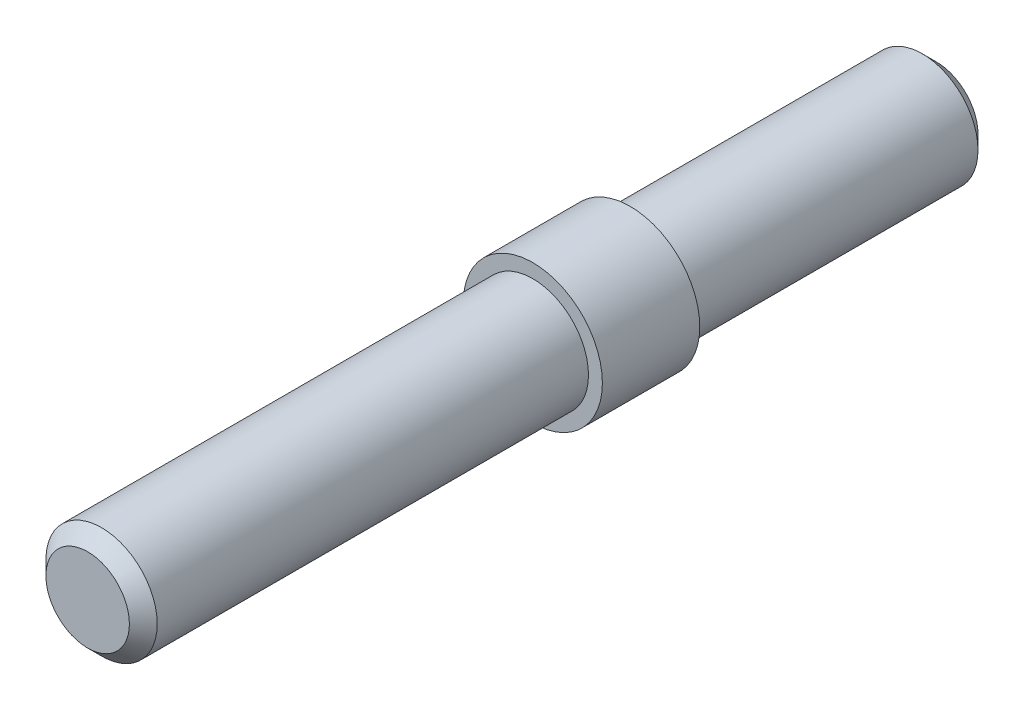
ISO-10303-21;
HEADER;
FILE_DESCRIPTION(('STEP AP214'),'2;1');
FILE_NAME('part.step','',(''),(''),'','','');
FILE_SCHEMA(('AUTOMOTIVE_DESIGN { 1 0 10303 214 1 1 1 1 }'));
ENDSEC;
DATA;
#1=APPLICATION_CONTEXT('core data for automotive mechanical design processes');
#2=APPLICATION_PROTOCOL_DEFINITION('international standard','automotive_design',2000,#1);
#3=PRODUCT_CONTEXT('',#1,'mechanical');
#4=PRODUCT('Part','Part','',(#3));
#5=PRODUCT_RELATED_PRODUCT_CATEGORY('part','',(#4));
#6=PRODUCT_DEFINITION_FORMATION('','',#4);
#7=PRODUCT_DEFINITION_CONTEXT('part definition',#1,'design');
#8=PRODUCT_DEFINITION('design','',#6,#7);
#9=PRODUCT_DEFINITION_SHAPE('','',#8);
#10=(LENGTH_UNIT() NAMED_UNIT(*) SI_UNIT(.MILLI.,.METRE.));
#11=(NAMED_UNIT(*) PLANE_ANGLE_UNIT() SI_UNIT($,.RADIAN.));
#12=(NAMED_UNIT(*) SI_UNIT($,.STERADIAN.) SOLID_ANGLE_UNIT());
#13=UNCERTAINTY_MEASURE_WITH_UNIT(LENGTH_MEASURE(1.E-05),#10,'distance_accuracy_value','');
#14=(GEOMETRIC_REPRESENTATION_CONTEXT(3) GLOBAL_UNCERTAINTY_ASSIGNED_CONTEXT((#13)) GLOBAL_UNIT_ASSIGNED_CONTEXT((#10,
#11,#12)) REPRESENTATION_CONTEXT('',''));
#15=CARTESIAN_POINT('',(0.,0.,0.));
#16=DIRECTION('',(0.,0.,1.));
#17=DIRECTION('',(1.,0.,0.));
#18=AXIS2_PLACEMENT_3D('',#15,#16,#17);
#19=CARTESIAN_POINT('',(0.,0.,-16.));
#20=DIRECTION('',(0.,0.,1.));
#21=DIRECTION('',(1.,0.,0.));
#22=AXIS2_PLACEMENT_3D('',#19,#20,#21);
#23=CYLINDRICAL_SURFACE('',#22,4.);
#24=CARTESIAN_POINT('',(0.,0.,13.));
#25=DIRECTION('',(0.,0.,1.));
#26=DIRECTION('',(1.,0.,0.));
#27=AXIS2_PLACEMENT_3D('',#24,#25,#26);
#28=CIRCLE('',#27,4.);
#29=CARTESIAN_POINT('',(4.,0.,13.));
#30=VERTEX_POINT('',#29);
#31=EDGE_CURVE('E87',#30,#30,#28,.F.);
#32=ORIENTED_EDGE('',*,*,#31,.F.);
#33=EDGE_LOOP('',(#32));
#34=FACE_BOUND('',#33,.T.);
#35=CARTESIAN_POINT('',(0.,0.,44.));
#36=DIRECTION('',(0.,0.,1.));
#37=DIRECTION('',(1.,0.,0.));
#38=AXIS2_PLACEMENT_3D('',#35,#36,#37);
#39=CIRCLE('',#38,4.);
#40=CARTESIAN_POINT('',(4.,0.,44.));
#41=VERTEX_POINT('',#40);
#42=EDGE_CURVE('E93',#41,#41,#39,.F.);
#43=ORIENTED_EDGE('',*,*,#42,.T.);
#44=EDGE_LOOP('',(#43));
#45=FACE_BOUND('',#44,.T.);
#46=CARTESIAN_POINT('',(0.,-4.,19.));
#47=CARTESIAN_POINT('',(-0.081235058937853,-4.00000217456151,19.0000029023031));
#48=CARTESIAN_POINT('',(-0.162450241781792,-3.99750379283184,18.9933802397516));
#49=CARTESIAN_POINT('',(-0.322453452352361,-3.98778696006928,18.9671718047301));
#50=CARTESIAN_POINT('',(-0.401241827987616,-3.98056918893993,18.9475878995294));
#51=CARTESIAN_POINT('',(-0.554060784990879,-3.96218832391545,18.8962469982282));
#52=CARTESIAN_POINT('',(-0.628100224162278,-3.9510328434944,18.8645134831782));
#53=CARTESIAN_POINT('',(-0.769799310160254,-3.92588767765353,18.7898935869842));
#54=CARTESIAN_POINT('',(-0.83745723917788,-3.91189723227548,18.7470042144558));
#55=CARTESIAN_POINT('',(-0.967346417045826,-3.88186246971217,18.6493874689291));
#56=CARTESIAN_POINT('',(-1.02927073015119,-3.86576002583566,18.5942697377406));
#57=CARTESIAN_POINT('',(-1.14324421474363,-3.83360220871327,18.4745895653412));
#58=CARTESIAN_POINT('',(-1.19529036359203,-3.81754685135033,18.4100242439121));
#59=CARTESIAN_POINT('',(-1.28998202215985,-3.78662470617731,18.2702825324768));
#60=CARTESIAN_POINT('',(-1.3321939319576,-3.77182648820818,18.1947956334542));
#61=CARTESIAN_POINT('',(-1.40318646334085,-3.74599860237433,18.0371516458315));
#62=CARTESIAN_POINT('',(-1.43197244961239,-3.73496742975881,17.9549972368449));
#63=CARTESIAN_POINT('',(-1.47408431017549,-3.71854412824136,17.7898832597418));
#64=CARTESIAN_POINT('',(-1.48799593218558,-3.71293924350838,17.7070949615646));
#65=CARTESIAN_POINT('',(-1.50179556531648,-3.70738061461215,17.5401838420062));
#66=CARTESIAN_POINT('',(-1.50168936802631,-3.70742453659305,17.4560615861255));
#67=CARTESIAN_POINT('',(-1.48790429610018,-3.71297511632055,17.294230474787));
#68=CARTESIAN_POINT('',(-1.47503808509004,-3.71815468871122,17.2164390939558));
#69=CARTESIAN_POINT('',(-1.4374416786833,-3.73284938059529,17.0642128495947));
#70=CARTESIAN_POINT('',(-1.41270969663258,-3.74236515298863,16.9897784933861));
#71=CARTESIAN_POINT('',(-1.35163748571904,-3.76485702190253,16.8447229322718));
#72=CARTESIAN_POINT('',(-1.31508648737101,-3.77789517988166,16.7742005138787));
#73=CARTESIAN_POINT('',(-1.23156073762698,-3.80594210139319,16.640054262409));
#74=CARTESIAN_POINT('',(-1.18458238728897,-3.82095154457158,16.5764328224803));
#75=CARTESIAN_POINT('',(-1.07781780766549,-3.85248038859113,16.4533963363491));
#76=CARTESIAN_POINT('',(-1.01738298716955,-3.86903347455671,16.3945513592519));
#77=CARTESIAN_POINT('',(-0.887312590819021,-3.90091728164086,16.2876620337942));
#78=CARTESIAN_POINT('',(-0.817675603497365,-3.91624781465952,16.2396193453943));
#79=CARTESIAN_POINT('',(-0.669723436992422,-3.9442639480908,16.1550696029375));
#80=CARTESIAN_POINT('',(-0.591290713844721,-3.95690498259616,16.1187524187789));
#81=CARTESIAN_POINT('',(-0.428836850524584,-3.97778718326962,16.06001739573));
#82=CARTESIAN_POINT('',(-0.344818210845768,-3.98603030341493,16.0375933834389));
#83=CARTESIAN_POINT('',(-0.178375243148666,-3.99684443228065,16.0083772124581));
#84=CARTESIAN_POINT('',(-0.0961036195622094,-3.99969369025686,16.0008173936175));
#85=CARTESIAN_POINT('',(0.0685724752550243,-4.00025893700126,15.9993089361001));
#86=CARTESIAN_POINT('',(0.150976912983373,-3.99797606386863,16.0053572796832));
#87=CARTESIAN_POINT('',(0.310262048561859,-3.98871709772643,16.0303100423087));
#88=CARTESIAN_POINT('',(0.387233328007336,-3.98192470962305,16.0487115437371));
#89=CARTESIAN_POINT('',(0.536941754957221,-3.96451477091717,16.0971860725473));
#90=CARTESIAN_POINT('',(0.609678350347534,-3.9538967228203,16.127260617948));
#91=CARTESIAN_POINT('',(0.751247765110156,-3.92949624407681,16.1991864124395));
#92=CARTESIAN_POINT('',(0.819903083557797,-3.91563000209348,16.2413577292234));
#93=CARTESIAN_POINT('',(0.949392711726627,-3.88626671564664,16.3359181031716));
#94=CARTESIAN_POINT('',(1.01022412027045,-3.87076907009516,16.3883109325452));
#95=CARTESIAN_POINT('',(1.12603079874454,-3.83873329490989,16.5054041221243));
#96=CARTESIAN_POINT('',(1.18046154123569,-3.82218696503729,16.5706421827727));
#97=CARTESIAN_POINT('',(1.27771050031904,-3.79078815746854,16.7096513847077));
#98=CARTESIAN_POINT('',(1.32052767414519,-3.77593583194399,16.7834232913885));
#99=CARTESIAN_POINT('',(1.39337773518998,-3.74966829822463,16.9380159867723));
#100=CARTESIAN_POINT('',(1.42335685446918,-3.73826760328493,17.0188647459104));
#101=CARTESIAN_POINT('',(1.46907883466889,-3.72054032891005,17.1850097636878));
#102=CARTESIAN_POINT('',(1.48483050305535,-3.71421061057491,17.2703032361981));
#103=CARTESIAN_POINT('',(1.50086347097839,-3.70775894792573,17.4370161595411));
#104=CARTESIAN_POINT('',(1.50207331495838,-3.70726444523341,17.5183326317169));
#105=CARTESIAN_POINT('',(1.49136715641593,-3.71158412745292,17.6799453162762));
#106=CARTESIAN_POINT('',(1.47945239850124,-3.71639780898899,17.7602416246716));
#107=CARTESIAN_POINT('',(1.44355815630242,-3.73048141585432,17.9150472267166));
#108=CARTESIAN_POINT('',(1.41995798316524,-3.73961085376663,17.9896583462453));
#109=CARTESIAN_POINT('',(1.3616969677992,-3.76121548297845,18.1339055084944));
#110=CARTESIAN_POINT('',(1.32703332944945,-3.77369151995215,18.2035402880701));
#111=CARTESIAN_POINT('',(1.24552075938154,-3.80139723903964,18.3398267896976));
#112=CARTESIAN_POINT('',(1.1981283280301,-3.81673698440964,18.4061307967999));
#113=CARTESIAN_POINT('',(1.09334485729906,-3.84806246757177,18.5301415609712));
#114=CARTESIAN_POINT('',(1.03595064012808,-3.86404840943145,18.5878455747868));
#115=CARTESIAN_POINT('',(0.909080396784625,-3.89590424609881,18.6962019558218));
#116=CARTESIAN_POINT('',(0.839118644212994,-3.91172104900645,18.7463037534347));
#117=CARTESIAN_POINT('',(0.691213223200823,-3.9405451445703,18.8340226552766));
#118=CARTESIAN_POINT('',(0.613268934090623,-3.95355221851559,18.8716387877364));
#119=CARTESIAN_POINT('',(0.447999082002313,-3.9757429260668,18.9343768290483));
#120=CARTESIAN_POINT('',(0.360413422234209,-3.98473657158356,18.9588870646019));
#121=CARTESIAN_POINT('',(0.181875733606382,-3.99686242179587,18.9916929599207));
#122=CARTESIAN_POINT('',(0.0909254163648588,-3.99999756603967,18.9999967514873));
#123=CARTESIAN_POINT('',(0.,-4.,19.));
#124=B_SPLINE_CURVE_WITH_KNOTS('',3,(#46,#47,#48,#49,#50,#51,#52,#53,#54,#55,#56,#57,#58,#59,
#60,#61,#62,#63,#64,#65,#66,#67,#68,#69,#70,#71,#72,#73,#74,#75,#76,#77,#78,#79,#80,#81,#82,#83,
#84,#85,#86,#87,#88,#89,#90,#91,#92,#93,#94,#95,#96,#97,#98,#99,#100,#101,#102,#103,#104,#105,
#106,#107,#108,#109,#110,#111,#112,#113,#114,#115,#116,#117,#118,#119,#120,#121,#122,#123),
.UNSPECIFIED.,.T.,.F.,(4,2,2,2,2,2,2,2,2,2,2,2,2,2,2,2,2,2,2,2,2,2,2,2,2,2,2,2,2,2,2,2,2,2,2,2,
2,2,4),(0.,0.24336980156056,0.486704549530461,0.729571369213573,0.97250337960949,
1.22473618582715,1.47704604925622,1.73896674501659,2.00078269352134,2.25185874416902,
2.50283106079707,2.73878345119972,2.97477138060589,3.21522408387019,3.45575990744259,
3.71246153335813,3.96920257905066,4.22991375286075,4.49050899698846,4.73725019635926,
4.98393668390521,5.2211443792384,5.45838293254454,5.702592218596,5.94689180019869,
6.20536519455659,6.46386178920142,6.72343066727205,6.98283874956508,7.22558763480253,
7.4683135021126,7.70363142426534,7.93900886656507,8.18672471884272,8.43451941997063,
8.69572329654039,8.95694749805103,9.22948515032043,9.50188601796128),.UNSPECIFIED.);
#125=CARTESIAN_POINT('',(0.,-4.,19.));
#126=VERTEX_POINT('',#125);
#127=EDGE_CURVE('E142',#126,#126,#124,.T.);
#128=ORIENTED_EDGE('',*,*,#127,.F.);
#129=EDGE_LOOP('',(#128));
#130=FACE_BOUND('',#129,.T.);
#131=ADVANCED_FACE('F72',(#34,#45,#130),#23,.T.);
#132=CARTESIAN_POINT('',(0.,0.,45.));
#133=DIRECTION('',(0.,0.,1.));
#134=DIRECTION('',(1.,0.,0.));
#135=AXIS2_PLACEMENT_3D('',#132,#133,#134);
#136=PLANE('',#135);
#137=CARTESIAN_POINT('',(0.,0.,45.));
#138=DIRECTION('',(0.,0.,1.));
#139=DIRECTION('',(1.,0.,0.));
#140=AXIS2_PLACEMENT_3D('',#137,#138,#139);
#141=CIRCLE('',#140,3.);
#142=CARTESIAN_POINT('',(3.,0.,45.));
#143=VERTEX_POINT('',#142);
#144=EDGE_CURVE('E150',#143,#143,#141,.T.);
#145=ORIENTED_EDGE('',*,*,#144,.T.);
#146=EDGE_LOOP('',(#145));
#147=FACE_BOUND('',#146,.T.);
#148=ADVANCED_FACE('F139',(#147),#136,.T.);
#149=CARTESIAN_POINT('',(0.,-10.,17.5));
#150=DIRECTION('',(0.,1.,0.));
#151=DIRECTION('',(0.,0.,1.));
#152=AXIS2_PLACEMENT_3D('',#149,#150,#151);
#153=CYLINDRICAL_SURFACE('',#152,1.5);
#154=ORIENTED_EDGE('',*,*,#127,.T.);
#155=EDGE_LOOP('',(#154));
#156=FACE_BOUND('',#155,.T.);
#157=CARTESIAN_POINT('',(0.,0.,17.5));
#158=DIRECTION('',(0.,1.,0.));
#159=DIRECTION('',(0.,0.,1.));
#160=AXIS2_PLACEMENT_3D('',#157,#158,#159);
#161=CIRCLE('',#160,1.5);
#162=CARTESIAN_POINT('',(0.,0.,19.));
#163=VERTEX_POINT('',#162);
#164=EDGE_CURVE('E151',#163,#163,#161,.T.);
#165=ORIENTED_EDGE('',*,*,#164,.T.);
#166=EDGE_LOOP('',(#165));
#167=FACE_BOUND('',#166,.T.);
#168=ADVANCED_FACE('F134',(#156,#167),#153,.F.);
#169=CARTESIAN_POINT('',(0.,0.,17.5));
#170=DIRECTION('',(0.,1.,0.));
#171=DIRECTION('',(0.,0.,1.));
#172=AXIS2_PLACEMENT_3D('',#169,#170,#171);
#173=PLANE('',#172);
#174=ORIENTED_EDGE('',*,*,#164,.F.);
#175=EDGE_LOOP('',(#174));
#176=FACE_BOUND('',#175,.T.);
#177=ADVANCED_FACE('F131',(#176),#173,.F.);
#178=CARTESIAN_POINT('',(0.,0.,45.));
#179=DIRECTION('',(0.,0.,-1.));
#180=DIRECTION('',(-1.,0.,0.));
#181=AXIS2_PLACEMENT_3D('',#178,#179,#180);
#182=CONICAL_SURFACE('',#181,3.,0.785398163397447);
#183=ORIENTED_EDGE('',*,*,#42,.F.);
#184=EDGE_LOOP('',(#183));
#185=FACE_BOUND('',#184,.T.);
#186=ORIENTED_EDGE('',*,*,#144,.F.);
#187=EDGE_LOOP('',(#186));
#188=FACE_BOUND('',#187,.T.);
#189=ADVANCED_FACE('F129',(#185,#188),#182,.T.);
#190=CARTESIAN_POINT('',(0.,0.,13.));
#191=DIRECTION('',(0.,0.,-1.));
#192=DIRECTION('',(-1.,0.,0.));
#193=AXIS2_PLACEMENT_3D('',#190,#191,#192);
#194=CYLINDRICAL_SURFACE('',#193,5.);
#195=CARTESIAN_POINT('',(0.,0.,13.));
#196=DIRECTION('',(0.,0.,1.));
#197=DIRECTION('',(1.,0.,0.));
#198=AXIS2_PLACEMENT_3D('',#195,#196,#197);
#199=CIRCLE('',#198,5.);
#200=CARTESIAN_POINT('',(5.,0.,13.));
#201=VERTEX_POINT('',#200);
#202=EDGE_CURVE('E161',#201,#201,#199,.T.);
#203=ORIENTED_EDGE('',*,*,#202,.F.);
#204=EDGE_LOOP('',(#203));
#205=FACE_BOUND('',#204,.T.);
#206=CARTESIAN_POINT('',(0.,0.,6.));
#207=DIRECTION('',(0.,0.,1.));
#208=DIRECTION('',(1.,0.,0.));
#209=AXIS2_PLACEMENT_3D('',#206,#207,#208);
#210=CIRCLE('',#209,5.);
#211=CARTESIAN_POINT('',(5.,0.,6.));
#212=VERTEX_POINT('',#211);
#213=EDGE_CURVE('E104',#212,#212,#210,.T.);
#214=ORIENTED_EDGE('',*,*,#213,.T.);
#215=EDGE_LOOP('',(#214));
#216=FACE_BOUND('',#215,.T.);
#217=ADVANCED_FACE('F121',(#205,#216),#194,.T.);
#218=CARTESIAN_POINT('',(0.,0.,13.));
#219=DIRECTION('',(0.,0.,1.));
#220=DIRECTION('',(1.,0.,0.));
#221=AXIS2_PLACEMENT_3D('',#218,#219,#220);
#222=PLANE('',#221);
#223=ORIENTED_EDGE('',*,*,#31,.T.);
#224=EDGE_LOOP('',(#223));
#225=FACE_BOUND('',#224,.T.);
#226=ORIENTED_EDGE('',*,*,#202,.T.);
#227=EDGE_LOOP('',(#226));
#228=FACE_BOUND('',#227,.T.);
#229=ADVANCED_FACE('F117',(#225,#228),#222,.T.);
#230=CARTESIAN_POINT('',(0.,0.,6.));
#231=DIRECTION('',(0.,0.,1.));
#232=DIRECTION('',(1.,0.,0.));
#233=AXIS2_PLACEMENT_3D('',#230,#231,#232);
#234=PLANE('',#233);
#235=CARTESIAN_POINT('',(0.,0.,6.));
#236=DIRECTION('',(0.,0.,1.));
#237=DIRECTION('',(1.,0.,0.));
#238=AXIS2_PLACEMENT_3D('',#235,#236,#237);
#239=CIRCLE('',#238,4.);
#240=CARTESIAN_POINT('',(4.,0.,6.));
#241=VERTEX_POINT('',#240);
#242=EDGE_CURVE('E158',#241,#241,#239,.F.);
#243=ORIENTED_EDGE('',*,*,#242,.F.);
#244=EDGE_LOOP('',(#243));
#245=FACE_BOUND('',#244,.T.);
#246=ORIENTED_EDGE('',*,*,#213,.F.);
#247=EDGE_LOOP('',(#246));
#248=FACE_BOUND('',#247,.T.);
#249=ADVANCED_FACE('F120',(#245,#248),#234,.F.);
#250=CARTESIAN_POINT('',(0.,0.,-16.));
#251=DIRECTION('',(0.,0.,1.));
#252=DIRECTION('',(1.,0.,0.));
#253=AXIS2_PLACEMENT_3D('',#250,#251,#252);
#254=PLANE('',#253);
#255=CARTESIAN_POINT('',(0.,0.,-16.));
#256=DIRECTION('',(0.,0.,1.));
#257=DIRECTION('',(1.,0.,0.));
#258=AXIS2_PLACEMENT_3D('',#255,#256,#257);
#259=CIRCLE('',#258,3.);
#260=CARTESIAN_POINT('',(3.,0.,-16.));
#261=VERTEX_POINT('',#260);
#262=EDGE_CURVE('E11',#261,#261,#259,.F.);
#263=ORIENTED_EDGE('',*,*,#262,.T.);
#264=EDGE_LOOP('',(#263));
#265=FACE_BOUND('',#264,.T.);
#266=ADVANCED_FACE('F125',(#265),#254,.F.);
#267=CARTESIAN_POINT('',(0.,0.,-15.));
#268=DIRECTION('',(0.,0.,1.));
#269=DIRECTION('',(1.,0.,0.));
#270=AXIS2_PLACEMENT_3D('',#267,#268,#269);
#271=CIRCLE('',#270,4.);
#272=CARTESIAN_POINT('',(4.,0.,-15.));
#273=VERTEX_POINT('',#272);
#274=EDGE_CURVE('E81',#273,#273,#271,.T.);
#275=ORIENTED_EDGE('',*,*,#274,.T.);
#276=EDGE_LOOP('',(#275));
#277=FACE_BOUND('',#276,.T.);
#278=CARTESIAN_POINT('',(0.,-4.,-9.5));
#279=CARTESIAN_POINT('',(-0.0812350589378531,-4.00000217456151,-9.49999709769689));
#280=CARTESIAN_POINT('',(-0.162450241781793,-3.99750379283184,-9.50661976024838));
#281=CARTESIAN_POINT('',(-0.322453452352362,-3.98778696006928,-9.53282819526992));
#282=CARTESIAN_POINT('',(-0.401241827987617,-3.98056918893993,-9.55241210047057));
#283=CARTESIAN_POINT('',(-0.55406078499088,-3.96218832391545,-9.60375300177176));
#284=CARTESIAN_POINT('',(-0.628100224162279,-3.9510328434944,-9.63548651682178));
#285=CARTESIAN_POINT('',(-0.769799310160256,-3.92588767765353,-9.71010641301582));
#286=CARTESIAN_POINT('',(-0.837457239177881,-3.91189723227548,-9.75299578554415));
#287=CARTESIAN_POINT('',(-0.967346417045828,-3.88186246971217,-9.85061253107091));
#288=CARTESIAN_POINT('',(-1.02927073015119,-3.86576002583566,-9.9057302622594));
#289=CARTESIAN_POINT('',(-1.14324421474363,-3.83360220871327,-10.0254104346588));
#290=CARTESIAN_POINT('',(-1.19529036359203,-3.81754685135033,-10.0899757560879));
#291=CARTESIAN_POINT('',(-1.28998202215985,-3.78662470617731,-10.2297174675232));
#292=CARTESIAN_POINT('',(-1.3321939319576,-3.77182648820818,-10.3052043665458));
#293=CARTESIAN_POINT('',(-1.40318646334085,-3.74599860237433,-10.4628483541685));
#294=CARTESIAN_POINT('',(-1.43197244961239,-3.73496742975881,-10.5450027631551));
#295=CARTESIAN_POINT('',(-1.47408431017549,-3.71854412824136,-10.7101167402582));
#296=CARTESIAN_POINT('',(-1.48799593218558,-3.71293924350838,-10.7929050384354));
#297=CARTESIAN_POINT('',(-1.50179556531648,-3.70738061461215,-10.9598161579938));
#298=CARTESIAN_POINT('',(-1.50168936802631,-3.70742453659305,-11.0439384138745));
#299=CARTESIAN_POINT('',(-1.48790429610018,-3.71297511632054,-11.205769525213));
#300=CARTESIAN_POINT('',(-1.47503808509004,-3.71815468871121,-11.2835609060442));
#301=CARTESIAN_POINT('',(-1.4374416786833,-3.73284938059529,-11.4357871504053));
#302=CARTESIAN_POINT('',(-1.41270969663259,-3.74236515298863,-11.5102215066139));
#303=CARTESIAN_POINT('',(-1.35163748571904,-3.76485702190253,-11.6552770677282));
#304=CARTESIAN_POINT('',(-1.31508648737101,-3.77789517988166,-11.7257994861213));
#305=CARTESIAN_POINT('',(-1.23156073762698,-3.80594210139319,-11.859945737591));
#306=CARTESIAN_POINT('',(-1.18458238728897,-3.82095154457158,-11.9235671775197));
#307=CARTESIAN_POINT('',(-1.07781780766549,-3.85248038859113,-12.0466036636509));
#308=CARTESIAN_POINT('',(-1.01738298716956,-3.86903347455671,-12.1054486407481));
#309=CARTESIAN_POINT('',(-0.887312590819022,-3.90091728164085,-12.2123379662058));
#310=CARTESIAN_POINT('',(-0.817675603497365,-3.91624781465952,-12.2603806546057));
#311=CARTESIAN_POINT('',(-0.66972343699242,-3.9442639480908,-12.3449303970625));
#312=CARTESIAN_POINT('',(-0.591290713844719,-3.95690498259616,-12.3812475812211));
#313=CARTESIAN_POINT('',(-0.428836850524583,-3.97778718326962,-12.43998260427));
#314=CARTESIAN_POINT('',(-0.344818210845767,-3.98603030341493,-12.4624066165611));
#315=CARTESIAN_POINT('',(-0.178375243148665,-3.99684443228065,-12.4916227875419));
#316=CARTESIAN_POINT('',(-0.0961036195622093,-3.99969369025686,-12.4991826063825));
#317=CARTESIAN_POINT('',(0.0685724752550243,-4.00025893700126,-12.5006910638999));
#318=CARTESIAN_POINT('',(0.150976912983373,-3.99797606386863,-12.4946427203168));
#319=CARTESIAN_POINT('',(0.31026204856186,-3.98871709772643,-12.4696899576913));
#320=CARTESIAN_POINT('',(0.387233328007336,-3.98192470962305,-12.4512884562629));
#321=CARTESIAN_POINT('',(0.536941754957222,-3.96451477091717,-12.4028139274527));
#322=CARTESIAN_POINT('',(0.609678350347535,-3.9538967228203,-12.372739382052));
#323=CARTESIAN_POINT('',(0.751247765110156,-3.92949624407681,-12.3008135875605));
#324=CARTESIAN_POINT('',(0.819903083557796,-3.91563000209348,-12.2586422707766));
#325=CARTESIAN_POINT('',(0.949392711726626,-3.88626671564664,-12.1640818968284));
#326=CARTESIAN_POINT('',(1.01022412027045,-3.87076907009516,-12.1116890674548));
#327=CARTESIAN_POINT('',(1.12603079874454,-3.8387332949099,-11.9945958778757));
#328=CARTESIAN_POINT('',(1.18046154123569,-3.82218696503729,-11.9293578172273));
#329=CARTESIAN_POINT('',(1.27771050031903,-3.79078815746854,-11.7903486152923));
#330=CARTESIAN_POINT('',(1.32052767414519,-3.77593583194399,-11.7165767086115));
#331=CARTESIAN_POINT('',(1.39337773518998,-3.74966829822463,-11.5619840132277));
#332=CARTESIAN_POINT('',(1.42335685446918,-3.73826760328493,-11.4811352540896));
#333=CARTESIAN_POINT('',(1.46907883466889,-3.72054032891005,-11.3149902363122));
#334=CARTESIAN_POINT('',(1.48483050305535,-3.71421061057491,-11.2296967638019));
#335=CARTESIAN_POINT('',(1.50086347097839,-3.70775894792573,-11.0629838404589));
#336=CARTESIAN_POINT('',(1.50207331495838,-3.70726444523341,-10.9816673682831));
#337=CARTESIAN_POINT('',(1.49136715641593,-3.71158412745292,-10.8200546837238));
#338=CARTESIAN_POINT('',(1.47945239850124,-3.71639780898899,-10.7397583753284));
#339=CARTESIAN_POINT('',(1.44355815630242,-3.73048141585432,-10.5849527732834));
#340=CARTESIAN_POINT('',(1.41995798316524,-3.73961085376663,-10.5103416537547));
#341=CARTESIAN_POINT('',(1.3616969677992,-3.76121548297845,-10.3660944915056));
#342=CARTESIAN_POINT('',(1.32703332944945,-3.77369151995215,-10.2964597119299));
#343=CARTESIAN_POINT('',(1.24552075938154,-3.80139723903964,-10.1601732103024));
#344=CARTESIAN_POINT('',(1.1981283280301,-3.81673698440964,-10.0938692032001));
#345=CARTESIAN_POINT('',(1.09334485729906,-3.84806246757177,-9.9698584390288));
#346=CARTESIAN_POINT('',(1.03595064012808,-3.86404840943145,-9.91215442521325));
#347=CARTESIAN_POINT('',(0.909080396784625,-3.89590424609881,-9.80379804417816));
#348=CARTESIAN_POINT('',(0.839118644212994,-3.91172104900645,-9.75369624656532));
#349=CARTESIAN_POINT('',(0.691213223200822,-3.94054514457031,-9.66597734472344));
#350=CARTESIAN_POINT('',(0.613268934090622,-3.95355221851559,-9.62836121226363));
#351=CARTESIAN_POINT('',(0.447999082002312,-3.9757429260668,-9.56562317095167));
#352=CARTESIAN_POINT('',(0.360413422234208,-3.98473657158356,-9.5411129353981));
#353=CARTESIAN_POINT('',(0.181875733606382,-3.99686242179587,-9.50830704007932));
#354=CARTESIAN_POINT('',(0.0909254163648589,-3.99999756603967,-9.50000324851267));
#355=CARTESIAN_POINT('',(0.,-4.,-9.5));
#356=B_SPLINE_CURVE_WITH_KNOTS('',3,(#278,#279,#280,#281,#282,#283,#284,#285,#286,#287,#288,
#289,#290,#291,#292,#293,#294,#295,#296,#297,#298,#299,#300,#301,#302,#303,#304,#305,#306,#307,
#308,#309,#310,#311,#312,#313,#314,#315,#316,#317,#318,#319,#320,#321,#322,#323,#324,#325,#326,
#327,#328,#329,#330,#331,#332,#333,#334,#335,#336,#337,#338,#339,#340,#341,#342,#343,#344,#345,
#346,#347,#348,#349,#350,#351,#352,#353,#354,#355),.UNSPECIFIED.,.T.,.F.,(4,2,2,2,2,2,2,2,2,2,2,
2,2,2,2,2,2,2,2,2,2,2,2,2,2,2,2,2,2,2,2,2,2,2,2,2,2,2,4),(0.,0.24336980156056,0.486704549530462,
0.729571369213575,0.972503379609493,1.22473618582716,1.47704604925622,1.73896674501659,
2.00078269352134,2.25185874416902,2.50283106079707,2.73878345119972,2.9747713806059,
3.21522408387019,3.45575990744259,3.71246153335813,3.96920257905067,4.22991375286076,
4.49050899698846,4.73725019635926,4.98393668390521,5.22114437923841,5.45838293254454,
5.702592218596,5.94689180019869,6.20536519455658,6.46386178920142,6.72343066727205,
6.98283874956508,7.22558763480253,7.4683135021126,7.70363142426535,7.93900886656507,
8.18672471884272,8.43451941997063,8.6957232965404,8.95694749805103,9.22948515032043,
9.50188601796129),.UNSPECIFIED.);
#357=CARTESIAN_POINT('',(0.,-4.,-9.5));
#358=VERTEX_POINT('',#357);
#359=EDGE_CURVE('E96',#358,#358,#356,.T.);
#360=ORIENTED_EDGE('',*,*,#359,.F.);
#361=EDGE_LOOP('',(#360));
#362=FACE_BOUND('',#361,.T.);
#363=ORIENTED_EDGE('',*,*,#242,.T.);
#364=EDGE_LOOP('',(#363));
#365=FACE_BOUND('',#364,.T.);
#366=ADVANCED_FACE('F115',(#277,#362,#365),#23,.T.);
#367=CARTESIAN_POINT('',(0.,-10.,-11.));
#368=DIRECTION('',(0.,1.,0.));
#369=DIRECTION('',(0.,0.,1.));
#370=AXIS2_PLACEMENT_3D('',#367,#368,#369);
#371=CYLINDRICAL_SURFACE('',#370,1.5);
#372=ORIENTED_EDGE('',*,*,#359,.T.);
#373=EDGE_LOOP('',(#372));
#374=FACE_BOUND('',#373,.T.);
#375=CARTESIAN_POINT('',(0.,0.,-11.));
#376=DIRECTION('',(0.,1.,0.));
#377=DIRECTION('',(0.,0.,1.));
#378=AXIS2_PLACEMENT_3D('',#375,#376,#377);
#379=CIRCLE('',#378,1.5);
#380=CARTESIAN_POINT('',(0.,0.,-9.5));
#381=VERTEX_POINT('',#380);
#382=EDGE_CURVE('E105',#381,#381,#379,.T.);
#383=ORIENTED_EDGE('',*,*,#382,.T.);
#384=EDGE_LOOP('',(#383));
#385=FACE_BOUND('',#384,.T.);
#386=ADVANCED_FACE('F109',(#374,#385),#371,.F.);
#387=CARTESIAN_POINT('',(0.,0.,-11.));
#388=DIRECTION('',(0.,1.,0.));
#389=DIRECTION('',(0.,0.,1.));
#390=AXIS2_PLACEMENT_3D('',#387,#388,#389);
#391=PLANE('',#390);
#392=ORIENTED_EDGE('',*,*,#382,.F.);
#393=EDGE_LOOP('',(#392));
#394=FACE_BOUND('',#393,.T.);
#395=ADVANCED_FACE('F114',(#394),#391,.F.);
#396=CARTESIAN_POINT('',(0.,0.,-15.));
#397=DIRECTION('',(0.,0.,1.));
#398=DIRECTION('',(1.,0.,0.));
#399=AXIS2_PLACEMENT_3D('',#396,#397,#398);
#400=CONICAL_SURFACE('',#399,4.,0.785398163397448);
#401=ORIENTED_EDGE('',*,*,#262,.F.);
#402=EDGE_LOOP('',(#401));
#403=FACE_BOUND('',#402,.T.);
#404=ORIENTED_EDGE('',*,*,#274,.F.);
#405=EDGE_LOOP('',(#404));
#406=FACE_BOUND('',#405,.T.);
#407=ADVANCED_FACE('F75',(#403,#406),#400,.T.);
#408=CLOSED_SHELL('',(#131,#148,#168,#177,#189,#217,#229,#249,#266,#366,#386,#395,#407));
#409=MANIFOLD_SOLID_BREP('B2',#408);
#410=ADVANCED_BREP_SHAPE_REPRESENTATION('',(#18,#409),#14);
#411=SHAPE_DEFINITION_REPRESENTATION(#9,#410);
ENDSEC;
END-ISO-10303-21;
